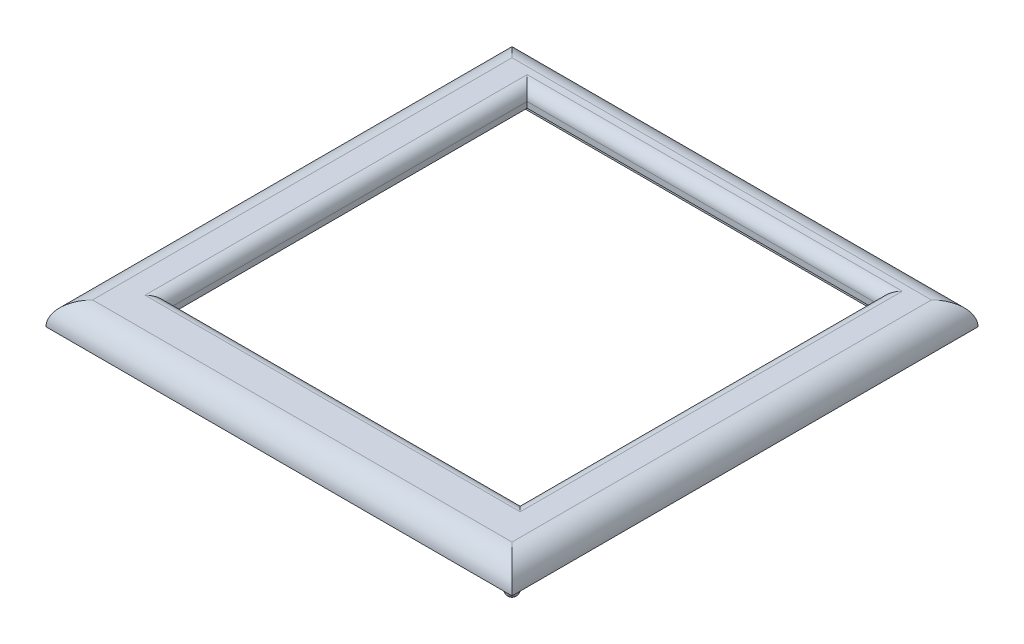
ISO-10303-21;
HEADER;
FILE_DESCRIPTION(('STEP AP214'),'2;1');
FILE_NAME('part.step','',(''),(''),'','','');
FILE_SCHEMA(('AUTOMOTIVE_DESIGN { 1 0 10303 214 1 1 1 1 }'));
ENDSEC;
DATA;
#1=APPLICATION_CONTEXT('core data for automotive mechanical design processes');
#2=APPLICATION_PROTOCOL_DEFINITION('international standard','automotive_design',2000,#1);
#3=PRODUCT_CONTEXT('',#1,'mechanical');
#4=PRODUCT('Part','Part','',(#3));
#5=PRODUCT_RELATED_PRODUCT_CATEGORY('part','',(#4));
#6=PRODUCT_DEFINITION_FORMATION('','',#4);
#7=PRODUCT_DEFINITION_CONTEXT('part definition',#1,'design');
#8=PRODUCT_DEFINITION('design','',#6,#7);
#9=PRODUCT_DEFINITION_SHAPE('','',#8);
#10=(LENGTH_UNIT() NAMED_UNIT(*) SI_UNIT(.MILLI.,.METRE.));
#11=(NAMED_UNIT(*) PLANE_ANGLE_UNIT() SI_UNIT($,.RADIAN.));
#12=(NAMED_UNIT(*) SI_UNIT($,.STERADIAN.) SOLID_ANGLE_UNIT());
#13=UNCERTAINTY_MEASURE_WITH_UNIT(LENGTH_MEASURE(1.E-05),#10,'distance_accuracy_value','');
#14=(GEOMETRIC_REPRESENTATION_CONTEXT(3) GLOBAL_UNCERTAINTY_ASSIGNED_CONTEXT((#13)) GLOBAL_UNIT_ASSIGNED_CONTEXT((#10,
#11,#12)) REPRESENTATION_CONTEXT('',''));
#15=CARTESIAN_POINT('',(0.,0.,0.));
#16=DIRECTION('',(0.,0.,1.));
#17=DIRECTION('',(1.,0.,0.));
#18=AXIS2_PLACEMENT_3D('',#15,#16,#17);
#19=CARTESIAN_POINT('',(-15.1,2.,14.4));
#20=DIRECTION('',(0.,0.,-1.));
#21=DIRECTION('',(-1.,0.,0.));
#22=AXIS2_PLACEMENT_3D('',#19,#20,#21);
#23=PLANE('',#22);
#24=DIRECTION('',(0.,-1.,0.));
#25=VECTOR('',#24,1.);
#26=CARTESIAN_POINT('',(-15.1,2.,14.4));
#27=LINE('',#26,#25);
#28=CARTESIAN_POINT('',(-15.1,1.,14.4));
#29=VERTEX_POINT('',#28);
#30=CARTESIAN_POINT('',(-15.1,0.5,14.4));
#31=VERTEX_POINT('',#30);
#32=EDGE_CURVE('E166',#29,#31,#27,.T.);
#33=ORIENTED_EDGE('',*,*,#32,.F.);
#34=DIRECTION('',(1.,0.,0.));
#35=VECTOR('',#34,1.);
#36=CARTESIAN_POINT('',(15.1,1.,14.4));
#37=LINE('',#36,#35);
#38=CARTESIAN_POINT('',(-8.,1.,14.4));
#39=VERTEX_POINT('',#38);
#40=EDGE_CURVE('E161',#29,#39,#37,.T.);
#41=ORIENTED_EDGE('',*,*,#40,.T.);
#42=DIRECTION('',(0.,-1.,0.));
#43=VECTOR('',#42,1.);
#44=CARTESIAN_POINT('',(-8.,1.,14.4));
#45=LINE('',#44,#43);
#46=CARTESIAN_POINT('',(-8.,0.5,14.4));
#47=VERTEX_POINT('',#46);
#48=EDGE_CURVE('E164',#39,#47,#45,.T.);
#49=ORIENTED_EDGE('',*,*,#48,.T.);
#50=DIRECTION('',(1.,0.,0.));
#51=VECTOR('',#50,1.);
#52=CARTESIAN_POINT('',(-15.1,0.5,14.4));
#53=LINE('',#52,#51);
#54=EDGE_CURVE('E276',#31,#47,#53,.T.);
#55=ORIENTED_EDGE('',*,*,#54,.F.);
#56=EDGE_LOOP('',(#33,#41,#49,#55));
#57=FACE_BOUND('',#56,.T.);
#58=ADVANCED_FACE('F35',(#57),#23,.T.);
#59=CARTESIAN_POINT('',(0.,2.,0.));
#60=DIRECTION('',(0.,-1.,0.));
#61=DIRECTION('',(0.,0.,-1.));
#62=AXIS2_PLACEMENT_3D('',#59,#60,#61);
#63=PLANE('',#62);
#64=DIRECTION('',(0.,0.,-1.));
#65=VECTOR('',#64,1.);
#66=CARTESIAN_POINT('',(18.,2.,0.));
#67=LINE('',#66,#65);
#68=CARTESIAN_POINT('',(18.,2.,18.));
#69=VERTEX_POINT('',#68);
#70=CARTESIAN_POINT('',(18.,2.,-18.));
#71=VERTEX_POINT('',#70);
#72=EDGE_CURVE('E50',#69,#71,#67,.T.);
#73=ORIENTED_EDGE('',*,*,#72,.T.);
#74=DIRECTION('',(-1.,0.,0.));
#75=VECTOR('',#74,1.);
#76=CARTESIAN_POINT('',(0.,2.,-18.));
#77=LINE('',#76,#75);
#78=CARTESIAN_POINT('',(-18.,2.,-18.));
#79=VERTEX_POINT('',#78);
#80=EDGE_CURVE('E307',#71,#79,#77,.T.);
#81=ORIENTED_EDGE('',*,*,#80,.T.);
#82=DIRECTION('',(0.,0.,1.));
#83=VECTOR('',#82,1.);
#84=CARTESIAN_POINT('',(-18.,2.,0.));
#85=LINE('',#84,#83);
#86=CARTESIAN_POINT('',(-18.,2.,18.));
#87=VERTEX_POINT('',#86);
#88=EDGE_CURVE('E294',#79,#87,#85,.T.);
#89=ORIENTED_EDGE('',*,*,#88,.T.);
#90=DIRECTION('',(1.,0.,0.));
#91=VECTOR('',#90,1.);
#92=CARTESIAN_POINT('',(0.,2.,18.));
#93=LINE('',#92,#91);
#94=EDGE_CURVE('E55',#87,#69,#93,.T.);
#95=ORIENTED_EDGE('',*,*,#94,.T.);
#96=EDGE_LOOP('',(#73,#81,#89,#95));
#97=FACE_BOUND('',#96,.T.);
#98=DIRECTION('',(-1.,0.,0.));
#99=VECTOR('',#98,1.);
#100=CARTESIAN_POINT('',(15.1,2.,-17.4));
#101=LINE('',#100,#99);
#102=CARTESIAN_POINT('',(-16.1,2.,-17.4));
#103=VERTEX_POINT('',#102);
#104=CARTESIAN_POINT('',(16.1,2.,-17.4));
#105=VERTEX_POINT('',#104);
#106=EDGE_CURVE('E283',#103,#105,#101,.F.);
#107=ORIENTED_EDGE('',*,*,#106,.T.);
#108=DIRECTION('',(0.,0.,-1.));
#109=VECTOR('',#108,1.);
#110=CARTESIAN_POINT('',(16.1,2.,14.4));
#111=LINE('',#110,#109);
#112=CARTESIAN_POINT('',(16.1,2.,15.4));
#113=VERTEX_POINT('',#112);
#114=EDGE_CURVE('E287',#105,#113,#111,.F.);
#115=ORIENTED_EDGE('',*,*,#114,.T.);
#116=DIRECTION('',(1.,0.,0.));
#117=VECTOR('',#116,1.);
#118=CARTESIAN_POINT('',(-15.1,2.,15.4));
#119=LINE('',#118,#117);
#120=CARTESIAN_POINT('',(-16.1,2.,15.4));
#121=VERTEX_POINT('',#120);
#122=EDGE_CURVE('E285',#113,#121,#119,.F.);
#123=ORIENTED_EDGE('',*,*,#122,.T.);
#124=DIRECTION('',(0.,0.,1.));
#125=VECTOR('',#124,1.);
#126=CARTESIAN_POINT('',(-16.1,2.,-16.4));
#127=LINE('',#126,#125);
#128=EDGE_CURVE('E281',#121,#103,#127,.F.);
#129=ORIENTED_EDGE('',*,*,#128,.T.);
#130=EDGE_LOOP('',(#107,#115,#123,#129));
#131=FACE_BOUND('',#130,.T.);
#132=ADVANCED_FACE('F342',(#97,#131),#63,.F.);
#133=CARTESIAN_POINT('',(0.,0.,0.));
#134=DIRECTION('',(0.,-1.,0.));
#135=DIRECTION('',(0.,0.,-1.));
#136=AXIS2_PLACEMENT_3D('',#133,#134,#135);
#137=PLANE('',#136);
#138=CARTESIAN_POINT('',(19.,0.,-19.));
#139=DIRECTION('',(0.,-1.,0.));
#140=DIRECTION('',(0.,0.,-1.));
#141=AXIS2_PLACEMENT_3D('',#138,#139,#140);
#142=CIRCLE('',#141,0.499999999999999);
#143=CARTESIAN_POINT('',(19.,0.,-19.5));
#144=VERTEX_POINT('',#143);
#145=EDGE_CURVE('E465',#144,#144,#142,.T.);
#146=ORIENTED_EDGE('',*,*,#145,.F.);
#147=EDGE_LOOP('',(#146));
#148=FACE_BOUND('',#147,.T.);
#149=CARTESIAN_POINT('',(-19.,0.,19.));
#150=DIRECTION('',(0.,-1.,0.));
#151=DIRECTION('',(0.,0.,-1.));
#152=AXIS2_PLACEMENT_3D('',#149,#150,#151);
#153=CIRCLE('',#152,0.499999999999999);
#154=CARTESIAN_POINT('',(-19.,0.,18.5));
#155=VERTEX_POINT('',#154);
#156=EDGE_CURVE('E469',#155,#155,#153,.T.);
#157=ORIENTED_EDGE('',*,*,#156,.F.);
#158=EDGE_LOOP('',(#157));
#159=FACE_BOUND('',#158,.T.);
#160=CARTESIAN_POINT('',(19.,0.,19.));
#161=DIRECTION('',(0.,-1.,0.));
#162=DIRECTION('',(0.,0.,-1.));
#163=AXIS2_PLACEMENT_3D('',#160,#161,#162);
#164=CIRCLE('',#163,0.499999999999999);
#165=CARTESIAN_POINT('',(19.,0.,18.5));
#166=VERTEX_POINT('',#165);
#167=EDGE_CURVE('E463',#166,#166,#164,.T.);
#168=ORIENTED_EDGE('',*,*,#167,.F.);
#169=EDGE_LOOP('',(#168));
#170=FACE_BOUND('',#169,.T.);
#171=CARTESIAN_POINT('',(-19.,0.,-19.));
#172=DIRECTION('',(0.,-1.,0.));
#173=DIRECTION('',(0.,0.,-1.));
#174=AXIS2_PLACEMENT_3D('',#171,#172,#173);
#175=CIRCLE('',#174,0.499999999999999);
#176=CARTESIAN_POINT('',(-19.,0.,-19.5));
#177=VERTEX_POINT('',#176);
#178=EDGE_CURVE('E313',#177,#177,#175,.T.);
#179=ORIENTED_EDGE('',*,*,#178,.F.);
#180=EDGE_LOOP('',(#179));
#181=FACE_BOUND('',#180,.T.);
#182=DIRECTION('',(0.,0.,-1.));
#183=VECTOR('',#182,1.);
#184=CARTESIAN_POINT('',(-15.8,0.,16.75));
#185=LINE('',#184,#183);
#186=CARTESIAN_POINT('',(-15.8,0.,16.75));
#187=VERTEX_POINT('',#186);
#188=CARTESIAN_POINT('',(-15.8,0.,-16.75));
#189=VERTEX_POINT('',#188);
#190=EDGE_CURVE('E212',#187,#189,#185,.T.);
#191=ORIENTED_EDGE('',*,*,#190,.F.);
#192=DIRECTION('',(-1.,0.,0.));
#193=VECTOR('',#192,1.);
#194=CARTESIAN_POINT('',(15.8,0.,16.75));
#195=LINE('',#194,#193);
#196=CARTESIAN_POINT('',(15.8,0.,16.75));
#197=VERTEX_POINT('',#196);
#198=EDGE_CURVE('E220',#197,#187,#195,.T.);
#199=ORIENTED_EDGE('',*,*,#198,.F.);
#200=DIRECTION('',(0.,0.,1.));
#201=VECTOR('',#200,1.);
#202=CARTESIAN_POINT('',(15.8,0.,16.75));
#203=LINE('',#202,#201);
#204=CARTESIAN_POINT('',(15.8,0.,-16.75));
#205=VERTEX_POINT('',#204);
#206=EDGE_CURVE('E234',#205,#197,#203,.T.);
#207=ORIENTED_EDGE('',*,*,#206,.F.);
#208=DIRECTION('',(1.,0.,0.));
#209=VECTOR('',#208,1.);
#210=CARTESIAN_POINT('',(15.8,0.,-16.75));
#211=LINE('',#210,#209);
#212=EDGE_CURVE('E231',#189,#205,#211,.T.);
#213=ORIENTED_EDGE('',*,*,#212,.F.);
#214=EDGE_LOOP('',(#191,#199,#207,#213));
#215=FACE_BOUND('',#214,.T.);
#216=DIRECTION('',(0.,0.,-1.));
#217=VECTOR('',#216,1.);
#218=CARTESIAN_POINT('',(20.,0.,20.));
#219=LINE('',#218,#217);
#220=CARTESIAN_POINT('',(20.,0.,20.));
#221=VERTEX_POINT('',#220);
#222=CARTESIAN_POINT('',(20.,0.,-20.));
#223=VERTEX_POINT('',#222);
#224=EDGE_CURVE('E263',#221,#223,#219,.T.);
#225=ORIENTED_EDGE('',*,*,#224,.F.);
#226=DIRECTION('',(1.,0.,0.));
#227=VECTOR('',#226,1.);
#228=CARTESIAN_POINT('',(-20.,0.,20.));
#229=LINE('',#228,#227);
#230=CARTESIAN_POINT('',(-20.,0.,20.));
#231=VERTEX_POINT('',#230);
#232=EDGE_CURVE('E272',#231,#221,#229,.T.);
#233=ORIENTED_EDGE('',*,*,#232,.F.);
#234=DIRECTION('',(0.,0.,1.));
#235=VECTOR('',#234,1.);
#236=CARTESIAN_POINT('',(-20.,0.,20.));
#237=LINE('',#236,#235);
#238=CARTESIAN_POINT('',(-20.,0.,-20.));
#239=VERTEX_POINT('',#238);
#240=EDGE_CURVE('E269',#239,#231,#237,.T.);
#241=ORIENTED_EDGE('',*,*,#240,.F.);
#242=DIRECTION('',(-1.,0.,0.));
#243=VECTOR('',#242,1.);
#244=CARTESIAN_POINT('',(-20.,0.,-20.));
#245=LINE('',#244,#243);
#246=EDGE_CURVE('E266',#223,#239,#245,.T.);
#247=ORIENTED_EDGE('',*,*,#246,.F.);
#248=EDGE_LOOP('',(#225,#233,#241,#247));
#249=FACE_BOUND('',#248,.T.);
#250=ADVANCED_FACE('F350',(#148,#159,#170,#181,#215,#249),#137,.T.);
#251=CARTESIAN_POINT('',(15.1,2.,-16.4));
#252=DIRECTION('',(-1.,0.,0.));
#253=DIRECTION('',(0.,0.,1.));
#254=AXIS2_PLACEMENT_3D('',#251,#252,#253);
#255=PLANE('',#254);
#256=DIRECTION('',(0.,-1.,0.));
#257=VECTOR('',#256,1.);
#258=CARTESIAN_POINT('',(15.1,2.,14.4));
#259=LINE('',#258,#257);
#260=CARTESIAN_POINT('',(15.1,1.,14.4));
#261=VERTEX_POINT('',#260);
#262=CARTESIAN_POINT('',(15.1,0.5,14.4));
#263=VERTEX_POINT('',#262);
#264=EDGE_CURVE('E256',#261,#263,#259,.T.);
#265=ORIENTED_EDGE('',*,*,#264,.F.);
#266=DIRECTION('',(0.,0.,-1.));
#267=VECTOR('',#266,1.);
#268=CARTESIAN_POINT('',(15.1,1.,-16.4));
#269=LINE('',#268,#267);
#270=CARTESIAN_POINT('',(15.1,1.,-16.4));
#271=VERTEX_POINT('',#270);
#272=EDGE_CURVE('E278',#261,#271,#269,.T.);
#273=ORIENTED_EDGE('',*,*,#272,.T.);
#274=DIRECTION('',(0.,-1.,0.));
#275=VECTOR('',#274,1.);
#276=CARTESIAN_POINT('',(15.1,2.,-16.4));
#277=LINE('',#276,#275);
#278=CARTESIAN_POINT('',(15.1,0.5,-16.4));
#279=VERTEX_POINT('',#278);
#280=EDGE_CURVE('E261',#271,#279,#277,.T.);
#281=ORIENTED_EDGE('',*,*,#280,.T.);
#282=DIRECTION('',(0.,0.,-1.));
#283=VECTOR('',#282,1.);
#284=CARTESIAN_POINT('',(15.1,0.5,-16.4));
#285=LINE('',#284,#283);
#286=EDGE_CURVE('E253',#263,#279,#285,.T.);
#287=ORIENTED_EDGE('',*,*,#286,.F.);
#288=EDGE_LOOP('',(#265,#273,#281,#287));
#289=FACE_BOUND('',#288,.T.);
#290=ADVANCED_FACE('F417',(#289),#255,.T.);
#291=CARTESIAN_POINT('',(-15.1,2.,-16.4));
#292=DIRECTION('',(0.,0.,1.));
#293=DIRECTION('',(1.,0.,0.));
#294=AXIS2_PLACEMENT_3D('',#291,#292,#293);
#295=PLANE('',#294);
#296=ORIENTED_EDGE('',*,*,#280,.F.);
#297=DIRECTION('',(-1.,0.,0.));
#298=VECTOR('',#297,1.);
#299=CARTESIAN_POINT('',(-15.1,1.,-16.4));
#300=LINE('',#299,#298);
#301=CARTESIAN_POINT('',(-15.1,1.,-16.4));
#302=VERTEX_POINT('',#301);
#303=EDGE_CURVE('E171',#271,#302,#300,.T.);
#304=ORIENTED_EDGE('',*,*,#303,.T.);
#305=DIRECTION('',(0.,-1.,0.));
#306=VECTOR('',#305,1.);
#307=CARTESIAN_POINT('',(-15.1,2.,-16.4));
#308=LINE('',#307,#306);
#309=CARTESIAN_POINT('',(-15.1,0.5,-16.4));
#310=VERTEX_POINT('',#309);
#311=EDGE_CURVE('E259',#302,#310,#308,.T.);
#312=ORIENTED_EDGE('',*,*,#311,.T.);
#313=DIRECTION('',(-1.,0.,0.));
#314=VECTOR('',#313,1.);
#315=CARTESIAN_POINT('',(-15.1,0.5,-16.4));
#316=LINE('',#315,#314);
#317=EDGE_CURVE('E250',#279,#310,#316,.T.);
#318=ORIENTED_EDGE('',*,*,#317,.F.);
#319=EDGE_LOOP('',(#296,#304,#312,#318));
#320=FACE_BOUND('',#319,.T.);
#321=ADVANCED_FACE('F365',(#320),#295,.T.);
#322=CARTESIAN_POINT('',(-15.1,2.,-16.4));
#323=DIRECTION('',(1.,0.,0.));
#324=DIRECTION('',(0.,0.,-1.));
#325=AXIS2_PLACEMENT_3D('',#322,#323,#324);
#326=PLANE('',#325);
#327=ORIENTED_EDGE('',*,*,#311,.F.);
#328=DIRECTION('',(0.,0.,1.));
#329=VECTOR('',#328,1.);
#330=CARTESIAN_POINT('',(-15.1,1.,14.4));
#331=LINE('',#330,#329);
#332=EDGE_CURVE('E292',#302,#29,#331,.T.);
#333=ORIENTED_EDGE('',*,*,#332,.T.);
#334=ORIENTED_EDGE('',*,*,#32,.T.);
#335=DIRECTION('',(0.,0.,1.));
#336=VECTOR('',#335,1.);
#337=CARTESIAN_POINT('',(-15.1,0.5,-16.4));
#338=LINE('',#337,#336);
#339=EDGE_CURVE('E241',#310,#31,#338,.T.);
#340=ORIENTED_EDGE('',*,*,#339,.F.);
#341=EDGE_LOOP('',(#327,#333,#334,#340));
#342=FACE_BOUND('',#341,.T.);
#343=ADVANCED_FACE('F356',(#342),#326,.T.);
#344=DIRECTION('',(0.,-1.,0.));
#345=VECTOR('',#344,1.);
#346=CARTESIAN_POINT('',(8.,1.,14.4));
#347=LINE('',#346,#345);
#348=CARTESIAN_POINT('',(8.,1.,14.4));
#349=VERTEX_POINT('',#348);
#350=CARTESIAN_POINT('',(8.,0.5,14.4));
#351=VERTEX_POINT('',#350);
#352=EDGE_CURVE('E182',#349,#351,#347,.T.);
#353=ORIENTED_EDGE('',*,*,#352,.F.);
#354=DIRECTION('',(1.,0.,0.));
#355=VECTOR('',#354,1.);
#356=CARTESIAN_POINT('',(15.1,1.,14.4));
#357=LINE('',#356,#355);
#358=EDGE_CURVE('E172',#349,#261,#357,.T.);
#359=ORIENTED_EDGE('',*,*,#358,.T.);
#360=ORIENTED_EDGE('',*,*,#264,.T.);
#361=EDGE_CURVE('E275',#351,#263,#53,.T.);
#362=ORIENTED_EDGE('',*,*,#361,.F.);
#363=EDGE_LOOP('',(#353,#359,#360,#362));
#364=FACE_BOUND('',#363,.T.);
#365=ADVANCED_FACE('F344',(#364),#23,.T.);
#366=CARTESIAN_POINT('',(-15.8,0.5,16.75));
#367=DIRECTION('',(-1.,0.,0.));
#368=DIRECTION('',(0.,0.,1.));
#369=AXIS2_PLACEMENT_3D('',#366,#367,#368);
#370=PLANE('',#369);
#371=ORIENTED_EDGE('',*,*,#190,.T.);
#372=DIRECTION('',(0.,-1.,0.));
#373=VECTOR('',#372,1.);
#374=CARTESIAN_POINT('',(-15.8,0.5,-16.75));
#375=LINE('',#374,#373);
#376=CARTESIAN_POINT('',(-15.8,0.5,-16.75));
#377=VERTEX_POINT('',#376);
#378=EDGE_CURVE('E229',#377,#189,#375,.T.);
#379=ORIENTED_EDGE('',*,*,#378,.F.);
#380=DIRECTION('',(0.,0.,-1.));
#381=VECTOR('',#380,1.);
#382=CARTESIAN_POINT('',(-15.8,0.5,16.75));
#383=LINE('',#382,#381);
#384=CARTESIAN_POINT('',(-15.8,0.5,16.75));
#385=VERTEX_POINT('',#384);
#386=EDGE_CURVE('E216',#385,#377,#383,.T.);
#387=ORIENTED_EDGE('',*,*,#386,.F.);
#388=DIRECTION('',(0.,-1.,0.));
#389=VECTOR('',#388,1.);
#390=CARTESIAN_POINT('',(-15.8,0.5,16.75));
#391=LINE('',#390,#389);
#392=EDGE_CURVE('E239',#385,#187,#391,.T.);
#393=ORIENTED_EDGE('',*,*,#392,.T.);
#394=EDGE_LOOP('',(#371,#379,#387,#393));
#395=FACE_BOUND('',#394,.T.);
#396=ADVANCED_FACE('F355',(#395),#370,.F.);
#397=CARTESIAN_POINT('',(15.8,0.5,16.75));
#398=DIRECTION('',(0.,0.,1.));
#399=DIRECTION('',(1.,0.,0.));
#400=AXIS2_PLACEMENT_3D('',#397,#398,#399);
#401=PLANE('',#400);
#402=ORIENTED_EDGE('',*,*,#198,.T.);
#403=ORIENTED_EDGE('',*,*,#392,.F.);
#404=DIRECTION('',(-1.,0.,0.));
#405=VECTOR('',#404,1.);
#406=CARTESIAN_POINT('',(15.8,0.5,16.75));
#407=LINE('',#406,#405);
#408=CARTESIAN_POINT('',(15.8,0.5,16.75));
#409=VERTEX_POINT('',#408);
#410=EDGE_CURVE('E226',#409,#385,#407,.T.);
#411=ORIENTED_EDGE('',*,*,#410,.F.);
#412=DIRECTION('',(0.,-1.,0.));
#413=VECTOR('',#412,1.);
#414=CARTESIAN_POINT('',(15.8,0.5,16.75));
#415=LINE('',#414,#413);
#416=EDGE_CURVE('E242',#409,#197,#415,.T.);
#417=ORIENTED_EDGE('',*,*,#416,.T.);
#418=EDGE_LOOP('',(#402,#403,#411,#417));
#419=FACE_BOUND('',#418,.T.);
#420=ADVANCED_FACE('F363',(#419),#401,.F.);
#421=CARTESIAN_POINT('',(15.8,0.5,16.75));
#422=DIRECTION('',(1.,0.,0.));
#423=DIRECTION('',(0.,0.,-1.));
#424=AXIS2_PLACEMENT_3D('',#421,#422,#423);
#425=PLANE('',#424);
#426=ORIENTED_EDGE('',*,*,#206,.T.);
#427=ORIENTED_EDGE('',*,*,#416,.F.);
#428=DIRECTION('',(0.,0.,1.));
#429=VECTOR('',#428,1.);
#430=CARTESIAN_POINT('',(15.8,0.5,16.75));
#431=LINE('',#430,#429);
#432=CARTESIAN_POINT('',(15.8,0.5,-16.75));
#433=VERTEX_POINT('',#432);
#434=EDGE_CURVE('E223',#433,#409,#431,.T.);
#435=ORIENTED_EDGE('',*,*,#434,.F.);
#436=DIRECTION('',(0.,-1.,0.));
#437=VECTOR('',#436,1.);
#438=CARTESIAN_POINT('',(15.8,0.5,-16.75));
#439=LINE('',#438,#437);
#440=EDGE_CURVE('E244',#433,#205,#439,.T.);
#441=ORIENTED_EDGE('',*,*,#440,.T.);
#442=EDGE_LOOP('',(#426,#427,#435,#441));
#443=FACE_BOUND('',#442,.T.);
#444=ADVANCED_FACE('F396',(#443),#425,.F.);
#445=CARTESIAN_POINT('',(15.8,0.5,-16.75));
#446=DIRECTION('',(0.,0.,-1.));
#447=DIRECTION('',(-1.,0.,0.));
#448=AXIS2_PLACEMENT_3D('',#445,#446,#447);
#449=PLANE('',#448);
#450=ORIENTED_EDGE('',*,*,#212,.T.);
#451=ORIENTED_EDGE('',*,*,#440,.F.);
#452=DIRECTION('',(1.,0.,0.));
#453=VECTOR('',#452,1.);
#454=CARTESIAN_POINT('',(15.8,0.5,-16.75));
#455=LINE('',#454,#453);
#456=EDGE_CURVE('E219',#377,#433,#455,.T.);
#457=ORIENTED_EDGE('',*,*,#456,.F.);
#458=ORIENTED_EDGE('',*,*,#378,.T.);
#459=EDGE_LOOP('',(#450,#451,#457,#458));
#460=FACE_BOUND('',#459,.T.);
#461=ADVANCED_FACE('F393',(#460),#449,.F.);
#462=CARTESIAN_POINT('',(0.,0.5,0.));
#463=DIRECTION('',(0.,1.,0.));
#464=DIRECTION('',(0.,0.,1.));
#465=AXIS2_PLACEMENT_3D('',#462,#463,#464);
#466=PLANE('',#465);
#467=ORIENTED_EDGE('',*,*,#54,.T.);
#468=DIRECTION('',(0.,0.,-1.));
#469=VECTOR('',#468,1.);
#470=CARTESIAN_POINT('',(-8.,0.5,14.4));
#471=LINE('',#470,#469);
#472=CARTESIAN_POINT('',(-8.,0.5,15.6));
#473=VERTEX_POINT('',#472);
#474=EDGE_CURVE('E181',#473,#47,#471,.T.);
#475=ORIENTED_EDGE('',*,*,#474,.F.);
#476=DIRECTION('',(-1.,0.,0.));
#477=VECTOR('',#476,1.);
#478=CARTESIAN_POINT('',(8.,0.5,15.6));
#479=LINE('',#478,#477);
#480=CARTESIAN_POINT('',(8.,0.5,15.6));
#481=VERTEX_POINT('',#480);
#482=EDGE_CURVE('E192',#481,#473,#479,.T.);
#483=ORIENTED_EDGE('',*,*,#482,.F.);
#484=DIRECTION('',(0.,0.,1.));
#485=VECTOR('',#484,1.);
#486=CARTESIAN_POINT('',(8.,0.5,14.4));
#487=LINE('',#486,#485);
#488=EDGE_CURVE('E204',#351,#481,#487,.T.);
#489=ORIENTED_EDGE('',*,*,#488,.F.);
#490=ORIENTED_EDGE('',*,*,#361,.T.);
#491=ORIENTED_EDGE('',*,*,#286,.T.);
#492=ORIENTED_EDGE('',*,*,#317,.T.);
#493=ORIENTED_EDGE('',*,*,#339,.T.);
#494=EDGE_LOOP('',(#467,#475,#483,#489,#490,#491,#492,#493));
#495=FACE_BOUND('',#494,.T.);
#496=ORIENTED_EDGE('',*,*,#386,.T.);
#497=ORIENTED_EDGE('',*,*,#456,.T.);
#498=ORIENTED_EDGE('',*,*,#434,.T.);
#499=ORIENTED_EDGE('',*,*,#410,.T.);
#500=EDGE_LOOP('',(#496,#497,#498,#499));
#501=FACE_BOUND('',#500,.T.);
#502=ADVANCED_FACE('F375',(#495,#501),#466,.F.);
#503=CARTESIAN_POINT('',(-8.,1.,14.4));
#504=DIRECTION('',(-1.,0.,0.));
#505=DIRECTION('',(0.,0.,1.));
#506=AXIS2_PLACEMENT_3D('',#503,#504,#505);
#507=PLANE('',#506);
#508=ORIENTED_EDGE('',*,*,#474,.T.);
#509=ORIENTED_EDGE('',*,*,#48,.F.);
#510=DIRECTION('',(0.,0.,-1.));
#511=VECTOR('',#510,1.);
#512=CARTESIAN_POINT('',(-8.,1.,14.4));
#513=LINE('',#512,#511);
#514=CARTESIAN_POINT('',(-8.,1.,15.6));
#515=VERTEX_POINT('',#514);
#516=EDGE_CURVE('E178',#515,#39,#513,.T.);
#517=ORIENTED_EDGE('',*,*,#516,.F.);
#518=DIRECTION('',(0.,-1.,0.));
#519=VECTOR('',#518,1.);
#520=CARTESIAN_POINT('',(-8.,1.,15.6));
#521=LINE('',#520,#519);
#522=EDGE_CURVE('E210',#515,#473,#521,.T.);
#523=ORIENTED_EDGE('',*,*,#522,.T.);
#524=EDGE_LOOP('',(#508,#509,#517,#523));
#525=FACE_BOUND('',#524,.T.);
#526=ADVANCED_FACE('F177',(#525),#507,.F.);
#527=CARTESIAN_POINT('',(8.,1.,15.6));
#528=DIRECTION('',(0.,0.,1.));
#529=DIRECTION('',(1.,0.,0.));
#530=AXIS2_PLACEMENT_3D('',#527,#528,#529);
#531=PLANE('',#530);
#532=ORIENTED_EDGE('',*,*,#482,.T.);
#533=ORIENTED_EDGE('',*,*,#522,.F.);
#534=DIRECTION('',(-1.,0.,0.));
#535=VECTOR('',#534,1.);
#536=CARTESIAN_POINT('',(8.,1.,15.6));
#537=LINE('',#536,#535);
#538=CARTESIAN_POINT('',(8.,1.,15.6));
#539=VERTEX_POINT('',#538);
#540=EDGE_CURVE('E183',#539,#515,#537,.T.);
#541=ORIENTED_EDGE('',*,*,#540,.F.);
#542=DIRECTION('',(0.,-1.,0.));
#543=VECTOR('',#542,1.);
#544=CARTESIAN_POINT('',(8.,1.,15.6));
#545=LINE('',#544,#543);
#546=EDGE_CURVE('E213',#539,#481,#545,.T.);
#547=ORIENTED_EDGE('',*,*,#546,.T.);
#548=EDGE_LOOP('',(#532,#533,#541,#547));
#549=FACE_BOUND('',#548,.T.);
#550=ADVANCED_FACE('F379',(#549),#531,.F.);
#551=CARTESIAN_POINT('',(8.,1.,14.4));
#552=DIRECTION('',(1.,0.,0.));
#553=DIRECTION('',(0.,0.,-1.));
#554=AXIS2_PLACEMENT_3D('',#551,#552,#553);
#555=PLANE('',#554);
#556=ORIENTED_EDGE('',*,*,#488,.T.);
#557=ORIENTED_EDGE('',*,*,#546,.F.);
#558=DIRECTION('',(0.,0.,1.));
#559=VECTOR('',#558,1.);
#560=CARTESIAN_POINT('',(8.,1.,14.4));
#561=LINE('',#560,#559);
#562=EDGE_CURVE('E197',#349,#539,#561,.T.);
#563=ORIENTED_EDGE('',*,*,#562,.F.);
#564=ORIENTED_EDGE('',*,*,#352,.T.);
#565=EDGE_LOOP('',(#556,#557,#563,#564));
#566=FACE_BOUND('',#565,.T.);
#567=ADVANCED_FACE('F372',(#566),#555,.F.);
#568=CARTESIAN_POINT('',(0.,1.,0.));
#569=DIRECTION('',(0.,-1.,0.));
#570=DIRECTION('',(0.,0.,-1.));
#571=AXIS2_PLACEMENT_3D('',#568,#569,#570);
#572=PLANE('',#571);
#573=ORIENTED_EDGE('',*,*,#516,.T.);
#574=DIRECTION('',(1.,0.,0.));
#575=VECTOR('',#574,1.);
#576=CARTESIAN_POINT('',(8.,1.,14.4));
#577=LINE('',#576,#575);
#578=EDGE_CURVE('E189',#39,#349,#577,.T.);
#579=ORIENTED_EDGE('',*,*,#578,.T.);
#580=ORIENTED_EDGE('',*,*,#562,.T.);
#581=ORIENTED_EDGE('',*,*,#540,.T.);
#582=EDGE_LOOP('',(#573,#579,#580,#581));
#583=FACE_BOUND('',#582,.T.);
#584=ADVANCED_FACE('F187',(#583),#572,.T.);
#585=CARTESIAN_POINT('',(-16.1,1.,-16.4));
#586=DIRECTION('',(0.,0.,-1.));
#587=DIRECTION('',(-1.,0.,0.));
#588=AXIS2_PLACEMENT_3D('',#585,#586,#587);
#589=CYLINDRICAL_SURFACE('',#588,1.);
#590=CARTESIAN_POINT('',(-16.1,1.,-17.4));
#591=DIRECTION('',(0.707106781186547,0.,-0.707106781186547));
#592=DIRECTION('',(0.707106781186547,0.,0.707106781186547));
#593=AXIS2_PLACEMENT_3D('',#590,#591,#592);
#594=ELLIPSE('',#593,1.41421356237309,1.);
#595=EDGE_CURVE('E300',#103,#302,#594,.T.);
#596=ORIENTED_EDGE('',*,*,#595,.F.);
#597=ORIENTED_EDGE('',*,*,#128,.F.);
#598=CARTESIAN_POINT('',(-16.1,1.,15.4));
#599=DIRECTION('',(-0.707106781186547,0.,-0.707106781186547));
#600=DIRECTION('',(-0.707106781186547,0.,0.707106781186547));
#601=AXIS2_PLACEMENT_3D('',#598,#599,#600);
#602=ELLIPSE('',#601,1.41421356237309,1.);
#603=EDGE_CURVE('E205',#29,#121,#602,.F.);
#604=ORIENTED_EDGE('',*,*,#603,.F.);
#605=ORIENTED_EDGE('',*,*,#332,.F.);
#606=EDGE_LOOP('',(#596,#597,#604,#605));
#607=FACE_BOUND('',#606,.T.);
#608=ADVANCED_FACE('F607',(#607),#589,.T.);
#609=CARTESIAN_POINT('',(-15.1,1.,15.4));
#610=DIRECTION('',(-1.,0.,0.));
#611=DIRECTION('',(0.,0.,1.));
#612=AXIS2_PLACEMENT_3D('',#609,#610,#611);
#613=CYLINDRICAL_SURFACE('',#612,1.);
#614=ORIENTED_EDGE('',*,*,#603,.T.);
#615=ORIENTED_EDGE('',*,*,#122,.F.);
#616=CARTESIAN_POINT('',(16.1,1.,15.4));
#617=DIRECTION('',(-0.707106781186547,0.,0.707106781186548));
#618=DIRECTION('',(0.707106781186548,0.,0.707106781186547));
#619=AXIS2_PLACEMENT_3D('',#616,#617,#618);
#620=ELLIPSE('',#619,1.4142135623731,1.);
#621=EDGE_CURVE('E297',#261,#113,#620,.F.);
#622=ORIENTED_EDGE('',*,*,#621,.F.);
#623=ORIENTED_EDGE('',*,*,#358,.F.);
#624=ORIENTED_EDGE('',*,*,#578,.F.);
#625=ORIENTED_EDGE('',*,*,#40,.F.);
#626=EDGE_LOOP('',(#614,#615,#622,#623,#624,#625));
#627=FACE_BOUND('',#626,.T.);
#628=ADVANCED_FACE('F195',(#627),#613,.T.);
#629=CARTESIAN_POINT('',(-15.1,1.,-17.4));
#630=DIRECTION('',(1.,0.,0.));
#631=DIRECTION('',(0.,0.,-1.));
#632=AXIS2_PLACEMENT_3D('',#629,#630,#631);
#633=CYLINDRICAL_SURFACE('',#632,1.);
#634=ORIENTED_EDGE('',*,*,#595,.T.);
#635=ORIENTED_EDGE('',*,*,#303,.F.);
#636=CARTESIAN_POINT('',(16.1,1.,-17.4));
#637=DIRECTION('',(0.707106781186548,0.,0.707106781186547));
#638=DIRECTION('',(-0.707106781186547,0.,0.707106781186548));
#639=AXIS2_PLACEMENT_3D('',#636,#637,#638);
#640=ELLIPSE('',#639,1.41421356237309,1.);
#641=EDGE_CURVE('E295',#105,#271,#640,.T.);
#642=ORIENTED_EDGE('',*,*,#641,.F.);
#643=ORIENTED_EDGE('',*,*,#106,.F.);
#644=EDGE_LOOP('',(#634,#635,#642,#643));
#645=FACE_BOUND('',#644,.T.);
#646=ADVANCED_FACE('F626',(#645),#633,.T.);
#647=CARTESIAN_POINT('',(16.1,1.,-16.4));
#648=DIRECTION('',(0.,0.,1.));
#649=DIRECTION('',(1.,0.,0.));
#650=AXIS2_PLACEMENT_3D('',#647,#648,#649);
#651=CYLINDRICAL_SURFACE('',#650,1.);
#652=ORIENTED_EDGE('',*,*,#621,.T.);
#653=ORIENTED_EDGE('',*,*,#114,.F.);
#654=ORIENTED_EDGE('',*,*,#641,.T.);
#655=ORIENTED_EDGE('',*,*,#272,.F.);
#656=EDGE_LOOP('',(#652,#653,#654,#655));
#657=FACE_BOUND('',#656,.T.);
#658=ADVANCED_FACE('F447',(#657),#651,.T.);
#659=CARTESIAN_POINT('',(0.,0.,18.));
#660=DIRECTION('',(1.,0.,0.));
#661=DIRECTION('',(0.,0.,-1.));
#662=AXIS2_PLACEMENT_3D('',#659,#660,#661);
#663=CYLINDRICAL_SURFACE('',#662,2.);
#664=CARTESIAN_POINT('',(-18.,0.,18.));
#665=DIRECTION('',(0.707106781186547,0.,0.707106781186547));
#666=DIRECTION('',(-0.707106781186547,0.,0.707106781186547));
#667=AXIS2_PLACEMENT_3D('',#664,#665,#666);
#668=ELLIPSE('',#667,2.82842712474619,2.);
#669=EDGE_CURVE('E315',#231,#87,#668,.F.);
#670=ORIENTED_EDGE('',*,*,#669,.F.);
#671=ORIENTED_EDGE('',*,*,#232,.T.);
#672=CARTESIAN_POINT('',(18.,0.,18.));
#673=DIRECTION('',(0.707106781186547,0.,-0.707106781186547));
#674=DIRECTION('',(0.707106781186547,0.,0.707106781186547));
#675=AXIS2_PLACEMENT_3D('',#672,#673,#674);
#676=ELLIPSE('',#675,2.82842712474619,2.);
#677=EDGE_CURVE('E298',#69,#221,#676,.T.);
#678=ORIENTED_EDGE('',*,*,#677,.F.);
#679=ORIENTED_EDGE('',*,*,#94,.F.);
#680=EDGE_LOOP('',(#670,#671,#678,#679));
#681=FACE_BOUND('',#680,.T.);
#682=ADVANCED_FACE('F424',(#681),#663,.T.);
#683=CARTESIAN_POINT('',(18.,0.,0.));
#684=DIRECTION('',(0.,0.,-1.));
#685=DIRECTION('',(-1.,0.,0.));
#686=AXIS2_PLACEMENT_3D('',#683,#684,#685);
#687=CYLINDRICAL_SURFACE('',#686,2.);
#688=ORIENTED_EDGE('',*,*,#677,.T.);
#689=ORIENTED_EDGE('',*,*,#224,.T.);
#690=CARTESIAN_POINT('',(18.,0.,-18.));
#691=DIRECTION('',(-0.707106781186547,0.,-0.707106781186547));
#692=DIRECTION('',(0.707106781186547,0.,-0.707106781186547));
#693=AXIS2_PLACEMENT_3D('',#690,#691,#692);
#694=ELLIPSE('',#693,2.82842712474619,2.);
#695=EDGE_CURVE('E312',#71,#223,#694,.T.);
#696=ORIENTED_EDGE('',*,*,#695,.F.);
#697=ORIENTED_EDGE('',*,*,#72,.F.);
#698=EDGE_LOOP('',(#688,#689,#696,#697));
#699=FACE_BOUND('',#698,.T.);
#700=ADVANCED_FACE('F425',(#699),#687,.T.);
#701=CARTESIAN_POINT('',(-18.,0.,0.));
#702=DIRECTION('',(0.,0.,1.));
#703=DIRECTION('',(1.,0.,0.));
#704=AXIS2_PLACEMENT_3D('',#701,#702,#703);
#705=CYLINDRICAL_SURFACE('',#704,2.);
#706=ORIENTED_EDGE('',*,*,#669,.T.);
#707=ORIENTED_EDGE('',*,*,#88,.F.);
#708=CARTESIAN_POINT('',(-18.,0.,-18.));
#709=DIRECTION('',(-0.707106781186547,0.,0.707106781186547));
#710=DIRECTION('',(0.707106781186547,0.,0.707106781186547));
#711=AXIS2_PLACEMENT_3D('',#708,#709,#710);
#712=ELLIPSE('',#711,2.82842712474619,2.);
#713=EDGE_CURVE('E310',#239,#79,#712,.F.);
#714=ORIENTED_EDGE('',*,*,#713,.F.);
#715=ORIENTED_EDGE('',*,*,#240,.T.);
#716=EDGE_LOOP('',(#706,#707,#714,#715));
#717=FACE_BOUND('',#716,.T.);
#718=ADVANCED_FACE('F433',(#717),#705,.T.);
#719=CARTESIAN_POINT('',(0.,0.,-18.));
#720=DIRECTION('',(-1.,0.,0.));
#721=DIRECTION('',(0.,0.,1.));
#722=AXIS2_PLACEMENT_3D('',#719,#720,#721);
#723=CYLINDRICAL_SURFACE('',#722,2.);
#724=ORIENTED_EDGE('',*,*,#695,.T.);
#725=ORIENTED_EDGE('',*,*,#246,.T.);
#726=ORIENTED_EDGE('',*,*,#713,.T.);
#727=ORIENTED_EDGE('',*,*,#80,.F.);
#728=EDGE_LOOP('',(#724,#725,#726,#727));
#729=FACE_BOUND('',#728,.T.);
#730=ADVANCED_FACE('F428',(#729),#723,.T.);
#731=CARTESIAN_POINT('',(-19.,-1.,-19.));
#732=DIRECTION('',(0.,1.,0.));
#733=DIRECTION('',(0.,0.,1.));
#734=AXIS2_PLACEMENT_3D('',#731,#732,#733);
#735=CYLINDRICAL_SURFACE('',#734,0.499999999999999);
#736=CARTESIAN_POINT('',(-19.,-0.5,-19.));
#737=DIRECTION('',(0.,1.,0.));
#738=DIRECTION('',(0.,0.,1.));
#739=AXIS2_PLACEMENT_3D('',#736,#737,#738);
#740=CIRCLE('',#739,0.499999999999999);
#741=CARTESIAN_POINT('',(-19.,-0.5,-18.5));
#742=VERTEX_POINT('',#741);
#743=EDGE_CURVE('E11',#742,#742,#740,.T.);
#744=ORIENTED_EDGE('',*,*,#743,.T.);
#745=EDGE_LOOP('',(#744));
#746=FACE_BOUND('',#745,.T.);
#747=ORIENTED_EDGE('',*,*,#178,.T.);
#748=EDGE_LOOP('',(#747));
#749=FACE_BOUND('',#748,.T.);
#750=ADVANCED_FACE('F440',(#746,#749),#735,.T.);
#751=CARTESIAN_POINT('',(19.,-1.,19.));
#752=DIRECTION('',(0.,1.,0.));
#753=DIRECTION('',(0.,0.,1.));
#754=AXIS2_PLACEMENT_3D('',#751,#752,#753);
#755=CYLINDRICAL_SURFACE('',#754,0.499999999999999);
#756=CARTESIAN_POINT('',(19.,-0.5,19.));
#757=DIRECTION('',(0.,1.,0.));
#758=DIRECTION('',(0.,0.,1.));
#759=AXIS2_PLACEMENT_3D('',#756,#757,#758);
#760=CIRCLE('',#759,0.499999999999999);
#761=CARTESIAN_POINT('',(19.,-0.5,19.5));
#762=VERTEX_POINT('',#761);
#763=EDGE_CURVE('E309',#762,#762,#760,.T.);
#764=ORIENTED_EDGE('',*,*,#763,.T.);
#765=EDGE_LOOP('',(#764));
#766=FACE_BOUND('',#765,.T.);
#767=ORIENTED_EDGE('',*,*,#167,.T.);
#768=EDGE_LOOP('',(#767));
#769=FACE_BOUND('',#768,.T.);
#770=ADVANCED_FACE('F450',(#766,#769),#755,.T.);
#771=CARTESIAN_POINT('',(19.,-0.5,19.));
#772=DIRECTION('',(0.,-1.,0.));
#773=DIRECTION('',(0.,0.,-1.));
#774=AXIS2_PLACEMENT_3D('',#771,#772,#773);
#775=SPHERICAL_SURFACE('',#774,0.5);
#776=ORIENTED_EDGE('',*,*,#763,.F.);
#777=EDGE_LOOP('',(#776));
#778=FACE_BOUND('',#777,.T.);
#779=ADVANCED_FACE('F448',(#778),#775,.T.);
#780=CARTESIAN_POINT('',(-19.,1.,19.));
#781=DIRECTION('',(0.,-1.,0.));
#782=DIRECTION('',(0.,0.,-1.));
#783=AXIS2_PLACEMENT_3D('',#780,#781,#782);
#784=CYLINDRICAL_SURFACE('',#783,0.499999999999999);
#785=CARTESIAN_POINT('',(-19.,0.5,19.));
#786=DIRECTION('',(0.,-1.,0.));
#787=DIRECTION('',(0.,0.,-1.));
#788=AXIS2_PLACEMENT_3D('',#785,#786,#787);
#789=CIRCLE('',#788,0.499999999999999);
#790=CARTESIAN_POINT('',(-19.,0.5,18.5));
#791=VERTEX_POINT('',#790);
#792=EDGE_CURVE('E43',#791,#791,#789,.F.);
#793=ORIENTED_EDGE('',*,*,#792,.T.);
#794=EDGE_LOOP('',(#793));
#795=FACE_BOUND('',#794,.T.);
#796=ORIENTED_EDGE('',*,*,#156,.T.);
#797=EDGE_LOOP('',(#796));
#798=FACE_BOUND('',#797,.T.);
#799=ADVANCED_FACE('F327',(#795,#798),#784,.F.);
#800=CARTESIAN_POINT('',(19.,1.,-19.));
#801=DIRECTION('',(0.,-1.,0.));
#802=DIRECTION('',(0.,0.,-1.));
#803=AXIS2_PLACEMENT_3D('',#800,#801,#802);
#804=CYLINDRICAL_SURFACE('',#803,0.499999999999999);
#805=CARTESIAN_POINT('',(19.,0.5,-19.));
#806=DIRECTION('',(0.,-1.,0.));
#807=DIRECTION('',(0.,0.,-1.));
#808=AXIS2_PLACEMENT_3D('',#805,#806,#807);
#809=CIRCLE('',#808,0.499999999999999);
#810=CARTESIAN_POINT('',(19.,0.5,-19.5));
#811=VERTEX_POINT('',#810);
#812=EDGE_CURVE('E322',#811,#811,#809,.F.);
#813=ORIENTED_EDGE('',*,*,#812,.T.);
#814=EDGE_LOOP('',(#813));
#815=FACE_BOUND('',#814,.T.);
#816=ORIENTED_EDGE('',*,*,#145,.T.);
#817=EDGE_LOOP('',(#816));
#818=FACE_BOUND('',#817,.T.);
#819=ADVANCED_FACE('F338',(#815,#818),#804,.F.);
#820=CARTESIAN_POINT('',(19.,0.5,-19.));
#821=DIRECTION('',(0.,-1.,0.));
#822=DIRECTION('',(0.,0.,-1.));
#823=AXIS2_PLACEMENT_3D('',#820,#821,#822);
#824=SPHERICAL_SURFACE('',#823,0.5);
#825=ORIENTED_EDGE('',*,*,#812,.F.);
#826=EDGE_LOOP('',(#825));
#827=FACE_BOUND('',#826,.T.);
#828=ADVANCED_FACE('F332',(#827),#824,.F.);
#829=CARTESIAN_POINT('',(-19.,0.5,19.));
#830=DIRECTION('',(0.,-1.,0.));
#831=DIRECTION('',(0.,0.,-1.));
#832=AXIS2_PLACEMENT_3D('',#829,#830,#831);
#833=SPHERICAL_SURFACE('',#832,0.5);
#834=ORIENTED_EDGE('',*,*,#792,.F.);
#835=EDGE_LOOP('',(#834));
#836=FACE_BOUND('',#835,.T.);
#837=ADVANCED_FACE('F330',(#836),#833,.F.);
#838=CARTESIAN_POINT('',(-19.,-0.5,-19.));
#839=DIRECTION('',(0.,-1.,0.));
#840=DIRECTION('',(0.,0.,-1.));
#841=AXIS2_PLACEMENT_3D('',#838,#839,#840);
#842=SPHERICAL_SURFACE('',#841,0.5);
#843=ORIENTED_EDGE('',*,*,#743,.F.);
#844=EDGE_LOOP('',(#843));
#845=FACE_BOUND('',#844,.T.);
#846=ADVANCED_FACE('F37',(#845),#842,.T.);
#847=CLOSED_SHELL('',(#58,#132,#250,#290,#321,#343,#365,#396,#420,#444,#461,#502,#526,#550,#567,
#584,#608,#628,#646,#658,#682,#700,#718,#730,#750,#770,#779,#799,#819,#828,#837,#846));
#848=MANIFOLD_SOLID_BREP('B2',#847);
#849=ADVANCED_BREP_SHAPE_REPRESENTATION('',(#18,#848),#14);
#850=SHAPE_DEFINITION_REPRESENTATION(#9,#849);
ENDSEC;
END-ISO-10303-21;
